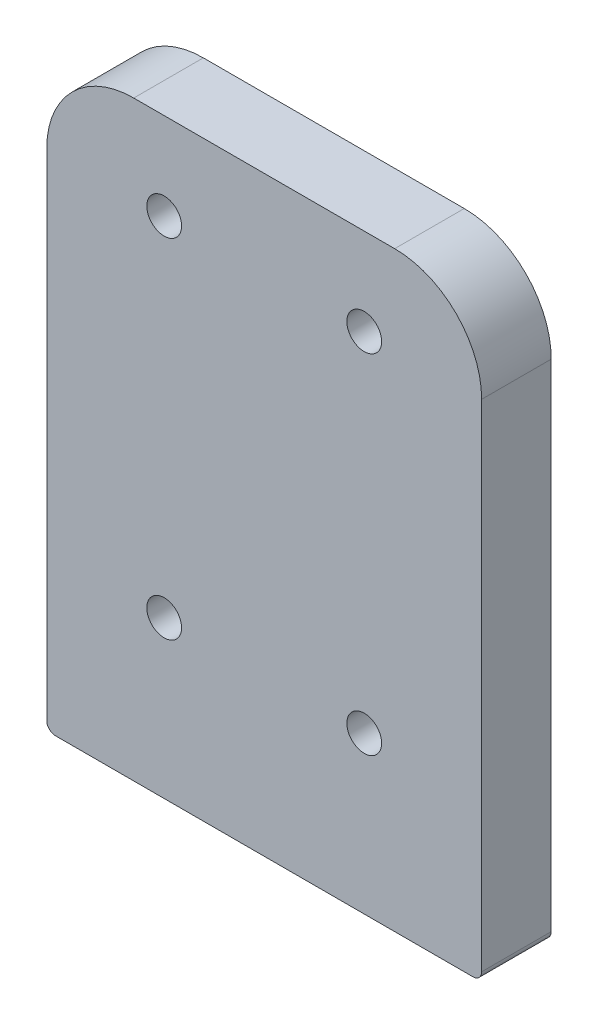
ISO-10303-21;
HEADER;
FILE_DESCRIPTION(('STEP AP214'),'2;1');
FILE_NAME('part.step','',(''),(''),'','','');
FILE_SCHEMA(('AUTOMOTIVE_DESIGN { 1 0 10303 214 1 1 1 1 }'));
ENDSEC;
DATA;
#1=APPLICATION_CONTEXT('core data for automotive mechanical design processes');
#2=APPLICATION_PROTOCOL_DEFINITION('international standard','automotive_design',2000,#1);
#3=PRODUCT_CONTEXT('',#1,'mechanical');
#4=PRODUCT('Part','Part','',(#3));
#5=PRODUCT_RELATED_PRODUCT_CATEGORY('part','',(#4));
#6=PRODUCT_DEFINITION_FORMATION('','',#4);
#7=PRODUCT_DEFINITION_CONTEXT('part definition',#1,'design');
#8=PRODUCT_DEFINITION('design','',#6,#7);
#9=PRODUCT_DEFINITION_SHAPE('','',#8);
#10=(LENGTH_UNIT() NAMED_UNIT(*) SI_UNIT(.MILLI.,.METRE.));
#11=(NAMED_UNIT(*) PLANE_ANGLE_UNIT() SI_UNIT($,.RADIAN.));
#12=(NAMED_UNIT(*) SI_UNIT($,.STERADIAN.) SOLID_ANGLE_UNIT());
#13=UNCERTAINTY_MEASURE_WITH_UNIT(LENGTH_MEASURE(1.E-05),#10,'distance_accuracy_value','');
#14=(GEOMETRIC_REPRESENTATION_CONTEXT(3) GLOBAL_UNCERTAINTY_ASSIGNED_CONTEXT((#13)) GLOBAL_UNIT_ASSIGNED_CONTEXT((#10,
#11,#12)) REPRESENTATION_CONTEXT('',''));
#15=CARTESIAN_POINT('',(0.,0.,0.));
#16=DIRECTION('',(0.,0.,1.));
#17=DIRECTION('',(1.,0.,0.));
#18=AXIS2_PLACEMENT_3D('',#15,#16,#17);
#19=CARTESIAN_POINT('',(25.,34.,8.));
#20=DIRECTION('',(-1.,0.,0.));
#21=DIRECTION('',(0.,-1.,0.));
#22=AXIS2_PLACEMENT_3D('',#19,#20,#21);
#23=PLANE('',#22);
#24=DIRECTION('',(0.,1.,0.));
#25=VECTOR('',#24,1.);
#26=CARTESIAN_POINT('',(25.,34.,8.));
#27=LINE('',#26,#25);
#28=CARTESIAN_POINT('',(25.,-33.,8.));
#29=VERTEX_POINT('',#28);
#30=CARTESIAN_POINT('',(25.,24.,8.));
#31=VERTEX_POINT('',#30);
#32=EDGE_CURVE('E181',#29,#31,#27,.T.);
#33=ORIENTED_EDGE('',*,*,#32,.F.);
#34=DIRECTION('',(0.,0.,-1.));
#35=VECTOR('',#34,1.);
#36=CARTESIAN_POINT('',(25.,-33.,8.));
#37=LINE('',#36,#35);
#38=CARTESIAN_POINT('',(25.,-33.,0.));
#39=VERTEX_POINT('',#38);
#40=EDGE_CURVE('E11',#29,#39,#37,.T.);
#41=ORIENTED_EDGE('',*,*,#40,.T.);
#42=DIRECTION('',(0.,1.,0.));
#43=VECTOR('',#42,1.);
#44=CARTESIAN_POINT('',(25.,34.,0.));
#45=LINE('',#44,#43);
#46=CARTESIAN_POINT('',(25.,24.,0.));
#47=VERTEX_POINT('',#46);
#48=EDGE_CURVE('E178',#39,#47,#45,.T.);
#49=ORIENTED_EDGE('',*,*,#48,.T.);
#50=DIRECTION('',(0.,0.,-1.));
#51=VECTOR('',#50,1.);
#52=CARTESIAN_POINT('',(25.,24.,8.));
#53=LINE('',#52,#51);
#54=EDGE_CURVE('E216',#47,#31,#53,.F.);
#55=ORIENTED_EDGE('',*,*,#54,.T.);
#56=EDGE_LOOP('',(#33,#41,#49,#55));
#57=FACE_BOUND('',#56,.T.);
#58=ADVANCED_FACE('F39',(#57),#23,.F.);
#59=CARTESIAN_POINT('',(-25.,34.,8.));
#60=DIRECTION('',(0.,-1.,0.));
#61=DIRECTION('',(0.,0.,-1.));
#62=AXIS2_PLACEMENT_3D('',#59,#60,#61);
#63=PLANE('',#62);
#64=DIRECTION('',(-1.,0.,0.));
#65=VECTOR('',#64,1.);
#66=CARTESIAN_POINT('',(-25.,34.,0.));
#67=LINE('',#66,#65);
#68=CARTESIAN_POINT('',(15.,34.,0.));
#69=VERTEX_POINT('',#68);
#70=CARTESIAN_POINT('',(-15.,34.,0.));
#71=VERTEX_POINT('',#70);
#72=EDGE_CURVE('E193',#69,#71,#67,.T.);
#73=ORIENTED_EDGE('',*,*,#72,.T.);
#74=DIRECTION('',(0.,0.,-1.));
#75=VECTOR('',#74,1.);
#76=CARTESIAN_POINT('',(-15.,34.,8.));
#77=LINE('',#76,#75);
#78=CARTESIAN_POINT('',(-15.,34.,8.));
#79=VERTEX_POINT('',#78);
#80=EDGE_CURVE('E210',#71,#79,#77,.F.);
#81=ORIENTED_EDGE('',*,*,#80,.T.);
#82=DIRECTION('',(-1.,0.,0.));
#83=VECTOR('',#82,1.);
#84=CARTESIAN_POINT('',(-25.,34.,8.));
#85=LINE('',#84,#83);
#86=CARTESIAN_POINT('',(15.,34.,8.));
#87=VERTEX_POINT('',#86);
#88=EDGE_CURVE('E183',#87,#79,#85,.T.);
#89=ORIENTED_EDGE('',*,*,#88,.F.);
#90=DIRECTION('',(0.,0.,-1.));
#91=VECTOR('',#90,1.);
#92=CARTESIAN_POINT('',(15.,34.,8.));
#93=LINE('',#92,#91);
#94=EDGE_CURVE('E207',#87,#69,#93,.T.);
#95=ORIENTED_EDGE('',*,*,#94,.T.);
#96=EDGE_LOOP('',(#73,#81,#89,#95));
#97=FACE_BOUND('',#96,.T.);
#98=ADVANCED_FACE('F250',(#97),#63,.F.);
#99=CARTESIAN_POINT('',(-25.,34.,8.));
#100=DIRECTION('',(1.,0.,0.));
#101=DIRECTION('',(0.,1.,0.));
#102=AXIS2_PLACEMENT_3D('',#99,#100,#101);
#103=PLANE('',#102);
#104=DIRECTION('',(0.,-1.,0.));
#105=VECTOR('',#104,1.);
#106=CARTESIAN_POINT('',(-25.,34.,0.));
#107=LINE('',#106,#105);
#108=CARTESIAN_POINT('',(-25.,24.,0.));
#109=VERTEX_POINT('',#108);
#110=CARTESIAN_POINT('',(-25.,-33.,0.));
#111=VERTEX_POINT('',#110);
#112=EDGE_CURVE('E196',#109,#111,#107,.T.);
#113=ORIENTED_EDGE('',*,*,#112,.T.);
#114=DIRECTION('',(0.,0.,-1.));
#115=VECTOR('',#114,1.);
#116=CARTESIAN_POINT('',(-25.,-33.,8.));
#117=LINE('',#116,#115);
#118=CARTESIAN_POINT('',(-25.,-33.,8.));
#119=VERTEX_POINT('',#118);
#120=EDGE_CURVE('E62',#111,#119,#117,.F.);
#121=ORIENTED_EDGE('',*,*,#120,.T.);
#122=DIRECTION('',(0.,-1.,0.));
#123=VECTOR('',#122,1.);
#124=CARTESIAN_POINT('',(-25.,34.,8.));
#125=LINE('',#124,#123);
#126=CARTESIAN_POINT('',(-25.,24.,8.));
#127=VERTEX_POINT('',#126);
#128=EDGE_CURVE('E187',#127,#119,#125,.T.);
#129=ORIENTED_EDGE('',*,*,#128,.F.);
#130=DIRECTION('',(0.,0.,-1.));
#131=VECTOR('',#130,1.);
#132=CARTESIAN_POINT('',(-25.,24.,8.));
#133=LINE('',#132,#131);
#134=EDGE_CURVE('E191',#127,#109,#133,.T.);
#135=ORIENTED_EDGE('',*,*,#134,.T.);
#136=EDGE_LOOP('',(#113,#121,#129,#135));
#137=FACE_BOUND('',#136,.T.);
#138=ADVANCED_FACE('F242',(#137),#103,.F.);
#139=CARTESIAN_POINT('',(-25.,-34.,8.));
#140=DIRECTION('',(0.,1.,0.));
#141=DIRECTION('',(0.,0.,1.));
#142=AXIS2_PLACEMENT_3D('',#139,#140,#141);
#143=PLANE('',#142);
#144=CARTESIAN_POINT('',(-12.5,-34.,4.));
#145=DIRECTION('',(0.,-1.,0.));
#146=DIRECTION('',(0.,0.,-1.));
#147=AXIS2_PLACEMENT_3D('',#144,#145,#146);
#148=CIRCLE('',#147,1.5);
#149=CARTESIAN_POINT('',(-12.5,-34.,2.5));
#150=VERTEX_POINT('',#149);
#151=EDGE_CURVE('E128',#150,#150,#148,.T.);
#152=ORIENTED_EDGE('',*,*,#151,.F.);
#153=EDGE_LOOP('',(#152));
#154=FACE_BOUND('',#153,.T.);
#155=CARTESIAN_POINT('',(12.5,-34.,4.));
#156=DIRECTION('',(0.,-1.,0.));
#157=DIRECTION('',(0.,0.,-1.));
#158=AXIS2_PLACEMENT_3D('',#155,#156,#157);
#159=CIRCLE('',#158,1.5);
#160=CARTESIAN_POINT('',(12.5,-34.,2.5));
#161=VERTEX_POINT('',#160);
#162=EDGE_CURVE('E127',#161,#161,#159,.T.);
#163=ORIENTED_EDGE('',*,*,#162,.F.);
#164=EDGE_LOOP('',(#163));
#165=FACE_BOUND('',#164,.T.);
#166=CARTESIAN_POINT('',(-20.,-34.,4.));
#167=DIRECTION('',(0.,-1.,0.));
#168=DIRECTION('',(0.,0.,-1.));
#169=AXIS2_PLACEMENT_3D('',#166,#167,#168);
#170=CIRCLE('',#169,2.025);
#171=CARTESIAN_POINT('',(-20.,-34.,1.975));
#172=VERTEX_POINT('',#171);
#173=EDGE_CURVE('E138',#172,#172,#170,.T.);
#174=ORIENTED_EDGE('',*,*,#173,.F.);
#175=EDGE_LOOP('',(#174));
#176=FACE_BOUND('',#175,.T.);
#177=CARTESIAN_POINT('',(20.,-34.,4.00000000000001));
#178=DIRECTION('',(0.,-1.,0.));
#179=DIRECTION('',(0.,0.,-1.));
#180=AXIS2_PLACEMENT_3D('',#177,#178,#179);
#181=CIRCLE('',#180,2.025);
#182=CARTESIAN_POINT('',(20.,-34.,1.97500000000001));
#183=VERTEX_POINT('',#182);
#184=EDGE_CURVE('E147',#183,#183,#181,.T.);
#185=ORIENTED_EDGE('',*,*,#184,.F.);
#186=EDGE_LOOP('',(#185));
#187=FACE_BOUND('',#186,.T.);
#188=DIRECTION('',(1.,0.,0.));
#189=VECTOR('',#188,1.);
#190=CARTESIAN_POINT('',(-25.,-34.,8.));
#191=LINE('',#190,#189);
#192=CARTESIAN_POINT('',(-24.,-34.,8.));
#193=VERTEX_POINT('',#192);
#194=CARTESIAN_POINT('',(24.,-34.,8.));
#195=VERTEX_POINT('',#194);
#196=EDGE_CURVE('E189',#193,#195,#191,.T.);
#197=ORIENTED_EDGE('',*,*,#196,.F.);
#198=DIRECTION('',(0.,0.,-1.));
#199=VECTOR('',#198,1.);
#200=CARTESIAN_POINT('',(-24.,-34.,8.));
#201=LINE('',#200,#199);
#202=CARTESIAN_POINT('',(-24.,-34.,0.));
#203=VERTEX_POINT('',#202);
#204=EDGE_CURVE('E221',#193,#203,#201,.T.);
#205=ORIENTED_EDGE('',*,*,#204,.T.);
#206=DIRECTION('',(1.,0.,0.));
#207=VECTOR('',#206,1.);
#208=CARTESIAN_POINT('',(-25.,-34.,0.));
#209=LINE('',#208,#207);
#210=CARTESIAN_POINT('',(24.,-34.,0.));
#211=VERTEX_POINT('',#210);
#212=EDGE_CURVE('E184',#203,#211,#209,.T.);
#213=ORIENTED_EDGE('',*,*,#212,.T.);
#214=DIRECTION('',(0.,0.,-1.));
#215=VECTOR('',#214,1.);
#216=CARTESIAN_POINT('',(24.,-34.,8.));
#217=LINE('',#216,#215);
#218=EDGE_CURVE('E219',#211,#195,#217,.F.);
#219=ORIENTED_EDGE('',*,*,#218,.T.);
#220=EDGE_LOOP('',(#197,#205,#213,#219));
#221=FACE_BOUND('',#220,.T.);
#222=ADVANCED_FACE('F235',(#154,#165,#176,#187,#221),#143,.F.);
#223=CARTESIAN_POINT('',(0.,0.,8.));
#224=DIRECTION('',(0.,0.,1.));
#225=DIRECTION('',(1.,0.,0.));
#226=AXIS2_PLACEMENT_3D('',#223,#224,#225);
#227=PLANE('',#226);
#228=CARTESIAN_POINT('',(11.5,-16.,8.));
#229=DIRECTION('',(0.,0.,1.));
#230=DIRECTION('',(-1.,0.,0.));
#231=AXIS2_PLACEMENT_3D('',#228,#229,#230);
#232=CIRCLE('',#231,2.);
#233=CARTESIAN_POINT('',(9.50000000000001,-16.,8.));
#234=VERTEX_POINT('',#233);
#235=EDGE_CURVE('E156',#234,#234,#232,.T.);
#236=ORIENTED_EDGE('',*,*,#235,.F.);
#237=EDGE_LOOP('',(#236));
#238=FACE_BOUND('',#237,.T.);
#239=CARTESIAN_POINT('',(11.5,24.,8.));
#240=DIRECTION('',(0.,0.,1.));
#241=DIRECTION('',(-1.,0.,0.));
#242=AXIS2_PLACEMENT_3D('',#239,#240,#241);
#243=CIRCLE('',#242,2.);
#244=CARTESIAN_POINT('',(9.5,24.,8.));
#245=VERTEX_POINT('',#244);
#246=EDGE_CURVE('E167',#245,#245,#243,.T.);
#247=ORIENTED_EDGE('',*,*,#246,.F.);
#248=EDGE_LOOP('',(#247));
#249=FACE_BOUND('',#248,.T.);
#250=CARTESIAN_POINT('',(-11.5,24.,8.));
#251=DIRECTION('',(0.,0.,1.));
#252=DIRECTION('',(1.,0.,0.));
#253=AXIS2_PLACEMENT_3D('',#250,#251,#252);
#254=CIRCLE('',#253,2.);
#255=CARTESIAN_POINT('',(-9.49999999999999,24.,8.));
#256=VERTEX_POINT('',#255);
#257=EDGE_CURVE('E161',#256,#256,#254,.T.);
#258=ORIENTED_EDGE('',*,*,#257,.F.);
#259=EDGE_LOOP('',(#258));
#260=FACE_BOUND('',#259,.T.);
#261=CARTESIAN_POINT('',(-11.5,-16.,8.));
#262=DIRECTION('',(0.,0.,1.));
#263=DIRECTION('',(1.,0.,0.));
#264=AXIS2_PLACEMENT_3D('',#261,#262,#263);
#265=CIRCLE('',#264,2.);
#266=CARTESIAN_POINT('',(-9.49999999999999,-16.,8.));
#267=VERTEX_POINT('',#266);
#268=EDGE_CURVE('E160',#267,#267,#265,.T.);
#269=ORIENTED_EDGE('',*,*,#268,.F.);
#270=EDGE_LOOP('',(#269));
#271=FACE_BOUND('',#270,.T.);
#272=ORIENTED_EDGE('',*,*,#128,.T.);
#273=CARTESIAN_POINT('',(-24.,-33.,8.));
#274=DIRECTION('',(0.,0.,1.));
#275=DIRECTION('',(1.,0.,0.));
#276=AXIS2_PLACEMENT_3D('',#273,#274,#275);
#277=CIRCLE('',#276,1.);
#278=EDGE_CURVE('E47',#119,#193,#277,.T.);
#279=ORIENTED_EDGE('',*,*,#278,.T.);
#280=ORIENTED_EDGE('',*,*,#196,.T.);
#281=CARTESIAN_POINT('',(24.,-33.,8.));
#282=DIRECTION('',(0.,0.,1.));
#283=DIRECTION('',(1.,0.,0.));
#284=AXIS2_PLACEMENT_3D('',#281,#282,#283);
#285=CIRCLE('',#284,1.);
#286=EDGE_CURVE('E54',#195,#29,#285,.T.);
#287=ORIENTED_EDGE('',*,*,#286,.T.);
#288=ORIENTED_EDGE('',*,*,#32,.T.);
#289=CARTESIAN_POINT('',(15.,24.,8.));
#290=DIRECTION('',(0.,0.,1.));
#291=DIRECTION('',(1.,0.,0.));
#292=AXIS2_PLACEMENT_3D('',#289,#290,#291);
#293=CIRCLE('',#292,10.);
#294=EDGE_CURVE('E212',#31,#87,#293,.T.);
#295=ORIENTED_EDGE('',*,*,#294,.T.);
#296=ORIENTED_EDGE('',*,*,#88,.T.);
#297=CARTESIAN_POINT('',(-15.,24.,8.));
#298=DIRECTION('',(0.,0.,1.));
#299=DIRECTION('',(1.,0.,0.));
#300=AXIS2_PLACEMENT_3D('',#297,#298,#299);
#301=CIRCLE('',#300,10.);
#302=EDGE_CURVE('E214',#79,#127,#301,.T.);
#303=ORIENTED_EDGE('',*,*,#302,.T.);
#304=EDGE_LOOP('',(#272,#279,#280,#287,#288,#295,#296,#303));
#305=FACE_BOUND('',#304,.T.);
#306=ADVANCED_FACE('F231',(#238,#249,#260,#271,#305),#227,.T.);
#307=CARTESIAN_POINT('',(0.,0.,0.));
#308=DIRECTION('',(0.,0.,1.));
#309=DIRECTION('',(1.,0.,0.));
#310=AXIS2_PLACEMENT_3D('',#307,#308,#309);
#311=PLANE('',#310);
#312=CARTESIAN_POINT('',(11.5,-16.,0.));
#313=DIRECTION('',(0.,0.,1.));
#314=DIRECTION('',(-1.,0.,0.));
#315=AXIS2_PLACEMENT_3D('',#312,#313,#314);
#316=CIRCLE('',#315,2.);
#317=CARTESIAN_POINT('',(9.50000000000001,-16.,0.));
#318=VERTEX_POINT('',#317);
#319=EDGE_CURVE('E170',#318,#318,#316,.T.);
#320=ORIENTED_EDGE('',*,*,#319,.T.);
#321=EDGE_LOOP('',(#320));
#322=FACE_BOUND('',#321,.T.);
#323=CARTESIAN_POINT('',(11.5,24.,0.));
#324=DIRECTION('',(0.,0.,1.));
#325=DIRECTION('',(-1.,0.,0.));
#326=AXIS2_PLACEMENT_3D('',#323,#324,#325);
#327=CIRCLE('',#326,2.);
#328=CARTESIAN_POINT('',(9.5,24.,0.));
#329=VERTEX_POINT('',#328);
#330=EDGE_CURVE('E164',#329,#329,#327,.T.);
#331=ORIENTED_EDGE('',*,*,#330,.T.);
#332=EDGE_LOOP('',(#331));
#333=FACE_BOUND('',#332,.T.);
#334=CARTESIAN_POINT('',(-11.5,24.,0.));
#335=DIRECTION('',(0.,0.,1.));
#336=DIRECTION('',(1.,0.,0.));
#337=AXIS2_PLACEMENT_3D('',#334,#335,#336);
#338=CIRCLE('',#337,2.);
#339=CARTESIAN_POINT('',(-9.49999999999999,24.,0.));
#340=VERTEX_POINT('',#339);
#341=EDGE_CURVE('E157',#340,#340,#338,.T.);
#342=ORIENTED_EDGE('',*,*,#341,.T.);
#343=EDGE_LOOP('',(#342));
#344=FACE_BOUND('',#343,.T.);
#345=CARTESIAN_POINT('',(-11.5,-16.,0.));
#346=DIRECTION('',(0.,0.,1.));
#347=DIRECTION('',(1.,0.,0.));
#348=AXIS2_PLACEMENT_3D('',#345,#346,#347);
#349=CIRCLE('',#348,2.);
#350=CARTESIAN_POINT('',(-9.49999999999999,-16.,0.));
#351=VERTEX_POINT('',#350);
#352=EDGE_CURVE('E175',#351,#351,#349,.T.);
#353=ORIENTED_EDGE('',*,*,#352,.T.);
#354=EDGE_LOOP('',(#353));
#355=FACE_BOUND('',#354,.T.);
#356=ORIENTED_EDGE('',*,*,#212,.F.);
#357=CARTESIAN_POINT('',(-24.,-33.,0.));
#358=DIRECTION('',(0.,0.,1.));
#359=DIRECTION('',(1.,0.,0.));
#360=AXIS2_PLACEMENT_3D('',#357,#358,#359);
#361=CIRCLE('',#360,1.);
#362=EDGE_CURVE('E226',#203,#111,#361,.F.);
#363=ORIENTED_EDGE('',*,*,#362,.T.);
#364=ORIENTED_EDGE('',*,*,#112,.F.);
#365=CARTESIAN_POINT('',(-15.,24.,0.));
#366=DIRECTION('',(0.,0.,1.));
#367=DIRECTION('',(1.,0.,0.));
#368=AXIS2_PLACEMENT_3D('',#365,#366,#367);
#369=CIRCLE('',#368,10.);
#370=EDGE_CURVE('E205',#109,#71,#369,.F.);
#371=ORIENTED_EDGE('',*,*,#370,.T.);
#372=ORIENTED_EDGE('',*,*,#72,.F.);
#373=CARTESIAN_POINT('',(15.,24.,0.));
#374=DIRECTION('',(0.,0.,1.));
#375=DIRECTION('',(1.,0.,0.));
#376=AXIS2_PLACEMENT_3D('',#373,#374,#375);
#377=CIRCLE('',#376,10.);
#378=EDGE_CURVE('E202',#69,#47,#377,.F.);
#379=ORIENTED_EDGE('',*,*,#378,.T.);
#380=ORIENTED_EDGE('',*,*,#48,.F.);
#381=CARTESIAN_POINT('',(24.,-33.,0.));
#382=DIRECTION('',(0.,0.,1.));
#383=DIRECTION('',(1.,0.,0.));
#384=AXIS2_PLACEMENT_3D('',#381,#382,#383);
#385=CIRCLE('',#384,1.);
#386=EDGE_CURVE('E224',#39,#211,#385,.F.);
#387=ORIENTED_EDGE('',*,*,#386,.T.);
#388=EDGE_LOOP('',(#356,#363,#364,#371,#372,#379,#380,#387));
#389=FACE_BOUND('',#388,.T.);
#390=ADVANCED_FACE('F241',(#322,#333,#344,#355,#389),#311,.F.);
#391=CARTESIAN_POINT('',(-11.5,-16.,0.));
#392=DIRECTION('',(0.,0.,1.));
#393=DIRECTION('',(1.,0.,0.));
#394=AXIS2_PLACEMENT_3D('',#391,#392,#393);
#395=CYLINDRICAL_SURFACE('',#394,2.);
#396=ORIENTED_EDGE('',*,*,#352,.F.);
#397=EDGE_LOOP('',(#396));
#398=FACE_BOUND('',#397,.T.);
#399=ORIENTED_EDGE('',*,*,#268,.T.);
#400=EDGE_LOOP('',(#399));
#401=FACE_BOUND('',#400,.T.);
#402=ADVANCED_FACE('F298',(#398,#401),#395,.F.);
#403=CARTESIAN_POINT('',(-11.5,24.,0.));
#404=DIRECTION('',(0.,0.,1.));
#405=DIRECTION('',(1.,0.,0.));
#406=AXIS2_PLACEMENT_3D('',#403,#404,#405);
#407=CYLINDRICAL_SURFACE('',#406,2.);
#408=ORIENTED_EDGE('',*,*,#341,.F.);
#409=EDGE_LOOP('',(#408));
#410=FACE_BOUND('',#409,.T.);
#411=ORIENTED_EDGE('',*,*,#257,.T.);
#412=EDGE_LOOP('',(#411));
#413=FACE_BOUND('',#412,.T.);
#414=ADVANCED_FACE('F446',(#410,#413),#407,.F.);
#415=CARTESIAN_POINT('',(11.5,24.,0.));
#416=DIRECTION('',(0.,0.,1.));
#417=DIRECTION('',(1.,0.,0.));
#418=AXIS2_PLACEMENT_3D('',#415,#416,#417);
#419=CYLINDRICAL_SURFACE('',#418,2.);
#420=ORIENTED_EDGE('',*,*,#330,.F.);
#421=EDGE_LOOP('',(#420));
#422=FACE_BOUND('',#421,.T.);
#423=ORIENTED_EDGE('',*,*,#246,.T.);
#424=EDGE_LOOP('',(#423));
#425=FACE_BOUND('',#424,.T.);
#426=ADVANCED_FACE('F437',(#422,#425),#419,.F.);
#427=CARTESIAN_POINT('',(11.5,-16.,0.));
#428=DIRECTION('',(0.,0.,1.));
#429=DIRECTION('',(1.,0.,0.));
#430=AXIS2_PLACEMENT_3D('',#427,#428,#429);
#431=CYLINDRICAL_SURFACE('',#430,2.);
#432=ORIENTED_EDGE('',*,*,#319,.F.);
#433=EDGE_LOOP('',(#432));
#434=FACE_BOUND('',#433,.T.);
#435=ORIENTED_EDGE('',*,*,#235,.T.);
#436=EDGE_LOOP('',(#435));
#437=FACE_BOUND('',#436,.T.);
#438=ADVANCED_FACE('F428',(#434,#437),#431,.F.);
#439=CARTESIAN_POINT('',(20.,-23.9,4.00000000000001));
#440=DIRECTION('',(0.,-1.,0.));
#441=DIRECTION('',(0.,0.,-1.));
#442=AXIS2_PLACEMENT_3D('',#439,#440,#441);
#443=CONICAL_SURFACE('',#442,1.65,1.02974425867665);
#444=CARTESIAN_POINT('',(20.,-22.9085799786045,4.00000000000001));
#445=VERTEX_POINT('',#444);
#446=VERTEX_LOOP('',#445);
#447=FACE_BOUND('',#446,.T.);
#448=CARTESIAN_POINT('',(20.,-23.9,4.00000000000001));
#449=DIRECTION('',(0.,-1.,0.));
#450=DIRECTION('',(0.,0.,-1.));
#451=AXIS2_PLACEMENT_3D('',#448,#449,#450);
#452=CIRCLE('',#451,1.65);
#453=CARTESIAN_POINT('',(20.,-23.9,2.35000000000001));
#454=VERTEX_POINT('',#453);
#455=EDGE_CURVE('E153',#454,#454,#452,.T.);
#456=ORIENTED_EDGE('',*,*,#455,.T.);
#457=EDGE_LOOP('',(#456));
#458=FACE_BOUND('',#457,.T.);
#459=ADVANCED_FACE('F418',(#447,#458),#443,.F.);
#460=CARTESIAN_POINT('',(20.,-34.,4.00000000000001));
#461=DIRECTION('',(0.,-1.,0.));
#462=DIRECTION('',(0.,0.,-1.));
#463=AXIS2_PLACEMENT_3D('',#460,#461,#462);
#464=CYLINDRICAL_SURFACE('',#463,1.64999999999999);
#465=ORIENTED_EDGE('',*,*,#455,.F.);
#466=EDGE_LOOP('',(#465));
#467=FACE_BOUND('',#466,.T.);
#468=CARTESIAN_POINT('',(20.,-33.625,4.00000000000001));
#469=DIRECTION('',(0.,-1.,0.));
#470=DIRECTION('',(0.,0.,-1.));
#471=AXIS2_PLACEMENT_3D('',#468,#469,#470);
#472=CIRCLE('',#471,1.64999999999999);
#473=CARTESIAN_POINT('',(20.,-33.625,2.35000000000002));
#474=VERTEX_POINT('',#473);
#475=EDGE_CURVE('E150',#474,#474,#472,.T.);
#476=ORIENTED_EDGE('',*,*,#475,.T.);
#477=EDGE_LOOP('',(#476));
#478=FACE_BOUND('',#477,.T.);
#479=ADVANCED_FACE('F409',(#467,#478),#464,.F.);
#480=CARTESIAN_POINT('',(20.,-34.,4.00000000000001));
#481=DIRECTION('',(0.,-1.,0.));
#482=DIRECTION('',(0.,0.,-1.));
#483=AXIS2_PLACEMENT_3D('',#480,#481,#482);
#484=CONICAL_SURFACE('',#483,2.025,0.785398163397462);
#485=ORIENTED_EDGE('',*,*,#475,.F.);
#486=EDGE_LOOP('',(#485));
#487=FACE_BOUND('',#486,.T.);
#488=ORIENTED_EDGE('',*,*,#184,.T.);
#489=EDGE_LOOP('',(#488));
#490=FACE_BOUND('',#489,.T.);
#491=ADVANCED_FACE('F400',(#487,#490),#484,.F.);
#492=CARTESIAN_POINT('',(-20.,-23.9,4.));
#493=DIRECTION('',(0.,-1.,0.));
#494=DIRECTION('',(0.,0.,-1.));
#495=AXIS2_PLACEMENT_3D('',#492,#493,#494);
#496=CONICAL_SURFACE('',#495,1.65,1.02974425867665);
#497=CARTESIAN_POINT('',(-20.,-22.9085799786045,4.));
#498=VERTEX_POINT('',#497);
#499=VERTEX_LOOP('',#498);
#500=FACE_BOUND('',#499,.T.);
#501=CARTESIAN_POINT('',(-20.,-23.9,4.));
#502=DIRECTION('',(0.,-1.,0.));
#503=DIRECTION('',(0.,0.,-1.));
#504=AXIS2_PLACEMENT_3D('',#501,#502,#503);
#505=CIRCLE('',#504,1.65);
#506=CARTESIAN_POINT('',(-20.,-23.9,2.35));
#507=VERTEX_POINT('',#506);
#508=EDGE_CURVE('E144',#507,#507,#505,.T.);
#509=ORIENTED_EDGE('',*,*,#508,.T.);
#510=EDGE_LOOP('',(#509));
#511=FACE_BOUND('',#510,.T.);
#512=ADVANCED_FACE('F390',(#500,#511),#496,.F.);
#513=CARTESIAN_POINT('',(-20.,-34.,4.));
#514=DIRECTION('',(0.,-1.,0.));
#515=DIRECTION('',(0.,0.,-1.));
#516=AXIS2_PLACEMENT_3D('',#513,#514,#515);
#517=CYLINDRICAL_SURFACE('',#516,1.64999999999999);
#518=ORIENTED_EDGE('',*,*,#508,.F.);
#519=EDGE_LOOP('',(#518));
#520=FACE_BOUND('',#519,.T.);
#521=CARTESIAN_POINT('',(-20.,-33.625,4.));
#522=DIRECTION('',(0.,-1.,0.));
#523=DIRECTION('',(0.,0.,-1.));
#524=AXIS2_PLACEMENT_3D('',#521,#522,#523);
#525=CIRCLE('',#524,1.64999999999999);
#526=CARTESIAN_POINT('',(-20.,-33.625,2.35000000000001));
#527=VERTEX_POINT('',#526);
#528=EDGE_CURVE('E141',#527,#527,#525,.T.);
#529=ORIENTED_EDGE('',*,*,#528,.T.);
#530=EDGE_LOOP('',(#529));
#531=FACE_BOUND('',#530,.T.);
#532=ADVANCED_FACE('F381',(#520,#531),#517,.F.);
#533=CARTESIAN_POINT('',(-20.,-34.,4.));
#534=DIRECTION('',(0.,-1.,0.));
#535=DIRECTION('',(0.,0.,-1.));
#536=AXIS2_PLACEMENT_3D('',#533,#534,#535);
#537=CONICAL_SURFACE('',#536,2.025,0.785398163397462);
#538=ORIENTED_EDGE('',*,*,#528,.F.);
#539=EDGE_LOOP('',(#538));
#540=FACE_BOUND('',#539,.T.);
#541=ORIENTED_EDGE('',*,*,#173,.T.);
#542=EDGE_LOOP('',(#541));
#543=FACE_BOUND('',#542,.T.);
#544=ADVANCED_FACE('F372',(#540,#543),#537,.F.);
#545=CARTESIAN_POINT('',(12.5,-26.,4.));
#546=DIRECTION('',(0.,-1.,0.));
#547=DIRECTION('',(0.,0.,-1.));
#548=AXIS2_PLACEMENT_3D('',#545,#546,#547);
#549=CONICAL_SURFACE('',#548,1.5,1.02974425867665);
#550=CARTESIAN_POINT('',(12.5,-25.0987090714587,4.));
#551=VERTEX_POINT('',#550);
#552=VERTEX_LOOP('',#551);
#553=FACE_BOUND('',#552,.T.);
#554=CARTESIAN_POINT('',(12.5,-26.,4.));
#555=DIRECTION('',(0.,-1.,0.));
#556=DIRECTION('',(0.,0.,-1.));
#557=AXIS2_PLACEMENT_3D('',#554,#555,#556);
#558=CIRCLE('',#557,1.5);
#559=CARTESIAN_POINT('',(12.5,-26.,2.5));
#560=VERTEX_POINT('',#559);
#561=EDGE_CURVE('E131',#560,#560,#558,.T.);
#562=ORIENTED_EDGE('',*,*,#561,.T.);
#563=EDGE_LOOP('',(#562));
#564=FACE_BOUND('',#563,.T.);
#565=ADVANCED_FACE('F363',(#553,#564),#549,.F.);
#566=CARTESIAN_POINT('',(12.5,-34.,4.));
#567=DIRECTION('',(0.,-1.,0.));
#568=DIRECTION('',(0.,0.,-1.));
#569=AXIS2_PLACEMENT_3D('',#566,#567,#568);
#570=CYLINDRICAL_SURFACE('',#569,1.5);
#571=ORIENTED_EDGE('',*,*,#561,.F.);
#572=EDGE_LOOP('',(#571));
#573=FACE_BOUND('',#572,.T.);
#574=ORIENTED_EDGE('',*,*,#162,.T.);
#575=EDGE_LOOP('',(#574));
#576=FACE_BOUND('',#575,.T.);
#577=ADVANCED_FACE('F121',(#573,#576),#570,.F.);
#578=CARTESIAN_POINT('',(-12.5,-26.,4.));
#579=DIRECTION('',(0.,-1.,0.));
#580=DIRECTION('',(0.,0.,-1.));
#581=AXIS2_PLACEMENT_3D('',#578,#579,#580);
#582=CONICAL_SURFACE('',#581,1.5,1.02974425867665);
#583=CARTESIAN_POINT('',(-12.5,-25.0987090714587,4.));
#584=VERTEX_POINT('',#583);
#585=VERTEX_LOOP('',#584);
#586=FACE_BOUND('',#585,.T.);
#587=CARTESIAN_POINT('',(-12.5,-26.,4.));
#588=DIRECTION('',(0.,-1.,0.));
#589=DIRECTION('',(0.,0.,-1.));
#590=AXIS2_PLACEMENT_3D('',#587,#588,#589);
#591=CIRCLE('',#590,1.5);
#592=CARTESIAN_POINT('',(-12.5,-26.,2.5));
#593=VERTEX_POINT('',#592);
#594=EDGE_CURVE('E125',#593,#593,#591,.T.);
#595=ORIENTED_EDGE('',*,*,#594,.T.);
#596=EDGE_LOOP('',(#595));
#597=FACE_BOUND('',#596,.T.);
#598=ADVANCED_FACE('F117',(#586,#597),#582,.F.);
#599=CARTESIAN_POINT('',(-12.5,-34.,4.));
#600=DIRECTION('',(0.,-1.,0.));
#601=DIRECTION('',(0.,0.,-1.));
#602=AXIS2_PLACEMENT_3D('',#599,#600,#601);
#603=CYLINDRICAL_SURFACE('',#602,1.5);
#604=ORIENTED_EDGE('',*,*,#594,.F.);
#605=EDGE_LOOP('',(#604));
#606=FACE_BOUND('',#605,.T.);
#607=ORIENTED_EDGE('',*,*,#151,.T.);
#608=EDGE_LOOP('',(#607));
#609=FACE_BOUND('',#608,.T.);
#610=ADVANCED_FACE('F120',(#606,#609),#603,.F.);
#611=CARTESIAN_POINT('',(-15.,24.,8.));
#612=DIRECTION('',(0.,0.,-1.));
#613=DIRECTION('',(-1.,0.,0.));
#614=AXIS2_PLACEMENT_3D('',#611,#612,#613);
#615=CYLINDRICAL_SURFACE('',#614,10.);
#616=ORIENTED_EDGE('',*,*,#302,.F.);
#617=ORIENTED_EDGE('',*,*,#80,.F.);
#618=ORIENTED_EDGE('',*,*,#370,.F.);
#619=ORIENTED_EDGE('',*,*,#134,.F.);
#620=EDGE_LOOP('',(#616,#617,#618,#619));
#621=FACE_BOUND('',#620,.T.);
#622=ADVANCED_FACE('F246',(#621),#615,.T.);
#623=CARTESIAN_POINT('',(15.,24.,8.));
#624=DIRECTION('',(0.,0.,-1.));
#625=DIRECTION('',(-1.,0.,0.));
#626=AXIS2_PLACEMENT_3D('',#623,#624,#625);
#627=CYLINDRICAL_SURFACE('',#626,10.);
#628=ORIENTED_EDGE('',*,*,#294,.F.);
#629=ORIENTED_EDGE('',*,*,#54,.F.);
#630=ORIENTED_EDGE('',*,*,#378,.F.);
#631=ORIENTED_EDGE('',*,*,#94,.F.);
#632=EDGE_LOOP('',(#628,#629,#630,#631));
#633=FACE_BOUND('',#632,.T.);
#634=ADVANCED_FACE('F255',(#633),#627,.T.);
#635=CARTESIAN_POINT('',(-24.,-33.,8.));
#636=DIRECTION('',(0.,0.,-1.));
#637=DIRECTION('',(-1.,0.,0.));
#638=AXIS2_PLACEMENT_3D('',#635,#636,#637);
#639=CYLINDRICAL_SURFACE('',#638,1.);
#640=ORIENTED_EDGE('',*,*,#278,.F.);
#641=ORIENTED_EDGE('',*,*,#120,.F.);
#642=ORIENTED_EDGE('',*,*,#362,.F.);
#643=ORIENTED_EDGE('',*,*,#204,.F.);
#644=EDGE_LOOP('',(#640,#641,#642,#643));
#645=FACE_BOUND('',#644,.T.);
#646=ADVANCED_FACE('F238',(#645),#639,.T.);
#647=CARTESIAN_POINT('',(24.,-33.,8.));
#648=DIRECTION('',(0.,0.,-1.));
#649=DIRECTION('',(-1.,0.,0.));
#650=AXIS2_PLACEMENT_3D('',#647,#648,#649);
#651=CYLINDRICAL_SURFACE('',#650,1.);
#652=ORIENTED_EDGE('',*,*,#286,.F.);
#653=ORIENTED_EDGE('',*,*,#218,.F.);
#654=ORIENTED_EDGE('',*,*,#386,.F.);
#655=ORIENTED_EDGE('',*,*,#40,.F.);
#656=EDGE_LOOP('',(#652,#653,#654,#655));
#657=FACE_BOUND('',#656,.T.);
#658=ADVANCED_FACE('F41',(#657),#651,.T.);
#659=CLOSED_SHELL('',(#58,#98,#138,#222,#306,#390,#402,#414,#426,#438,#459,#479,#491,#512,#532,
#544,#565,#577,#598,#610,#622,#634,#646,#658));
#660=MANIFOLD_SOLID_BREP('B2',#659);
#661=ADVANCED_BREP_SHAPE_REPRESENTATION('',(#18,#660),#14);
#662=SHAPE_DEFINITION_REPRESENTATION(#9,#661);
ENDSEC;
END-ISO-10303-21;
